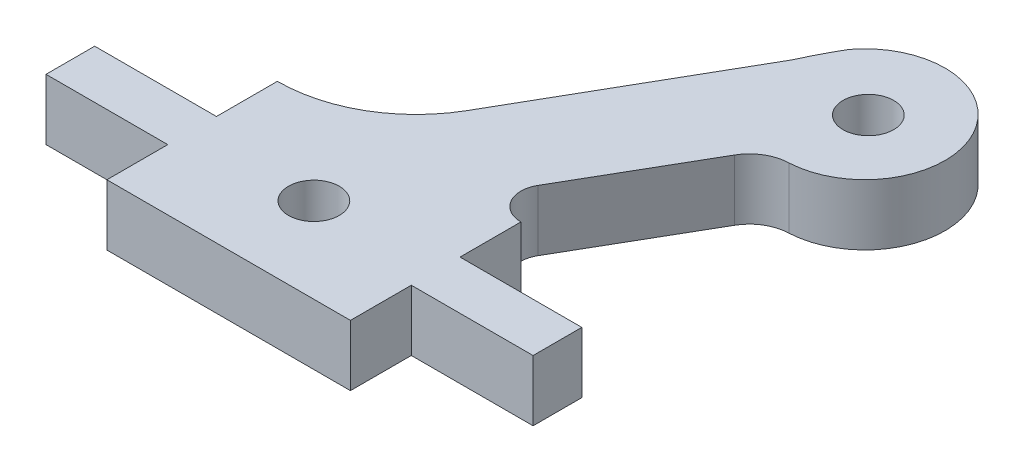
ISO-10303-21;
HEADER;
FILE_DESCRIPTION(('STEP AP214'),'2;1');
FILE_NAME('part.step','',(''),(''),'','','');
FILE_SCHEMA(('AUTOMOTIVE_DESIGN { 1 0 10303 214 1 1 1 1 }'));
ENDSEC;
DATA;
#1=APPLICATION_CONTEXT('core data for automotive mechanical design processes');
#2=APPLICATION_PROTOCOL_DEFINITION('international standard','automotive_design',2000,#1);
#3=PRODUCT_CONTEXT('',#1,'mechanical');
#4=PRODUCT('Part','Part','',(#3));
#5=PRODUCT_RELATED_PRODUCT_CATEGORY('part','',(#4));
#6=PRODUCT_DEFINITION_FORMATION('','',#4);
#7=PRODUCT_DEFINITION_CONTEXT('part definition',#1,'design');
#8=PRODUCT_DEFINITION('design','',#6,#7);
#9=PRODUCT_DEFINITION_SHAPE('','',#8);
#10=(LENGTH_UNIT() NAMED_UNIT(*) SI_UNIT(.MILLI.,.METRE.));
#11=(NAMED_UNIT(*) PLANE_ANGLE_UNIT() SI_UNIT($,.RADIAN.));
#12=(NAMED_UNIT(*) SI_UNIT($,.STERADIAN.) SOLID_ANGLE_UNIT());
#13=UNCERTAINTY_MEASURE_WITH_UNIT(LENGTH_MEASURE(1.E-05),#10,'distance_accuracy_value','');
#14=(GEOMETRIC_REPRESENTATION_CONTEXT(3) GLOBAL_UNCERTAINTY_ASSIGNED_CONTEXT((#13)) GLOBAL_UNIT_ASSIGNED_CONTEXT((#10,
#11,#12)) REPRESENTATION_CONTEXT('',''));
#15=CARTESIAN_POINT('',(0.,0.,0.));
#16=DIRECTION('',(0.,0.,1.));
#17=DIRECTION('',(1.,0.,0.));
#18=AXIS2_PLACEMENT_3D('',#15,#16,#17);
#19=CARTESIAN_POINT('',(182.99665481551,3.,-106.325156903223));
#20=DIRECTION('',(0.,-1.,0.));
#21=DIRECTION('',(0.,0.,-1.));
#22=AXIS2_PLACEMENT_3D('',#19,#20,#21);
#23=CYLINDRICAL_SURFACE('',#22,6.83457572202902);
#24=CARTESIAN_POINT('',(182.99665481551,0.,-106.325156903223));
#25=DIRECTION('',(0.,1.,0.));
#26=DIRECTION('',(0.,0.,1.));
#27=AXIS2_PLACEMENT_3D('',#24,#25,#26);
#28=CIRCLE('',#27,6.83457572202902);
#29=CARTESIAN_POINT('',(182.997065782668,0.,-99.4905811935497));
#30=VERTEX_POINT('',#29);
#31=CARTESIAN_POINT('',(188.915903996961,0.,-102.908445849002));
#32=VERTEX_POINT('',#31);
#33=EDGE_CURVE('E193',#30,#32,#28,.T.);
#34=ORIENTED_EDGE('',*,*,#33,.F.);
#35=DIRECTION('',(0.,-1.,0.));
#36=VECTOR('',#35,1.);
#37=CARTESIAN_POINT('',(182.997065782668,3.,-99.4905811935497));
#38=LINE('',#37,#36);
#39=CARTESIAN_POINT('',(182.997065782668,3.,-99.4905811935497));
#40=VERTEX_POINT('',#39);
#41=EDGE_CURVE('E11',#40,#30,#38,.T.);
#42=ORIENTED_EDGE('',*,*,#41,.F.);
#43=CARTESIAN_POINT('',(182.99665481551,3.,-106.325156903223));
#44=DIRECTION('',(0.,1.,0.));
#45=DIRECTION('',(0.,0.,1.));
#46=AXIS2_PLACEMENT_3D('',#43,#44,#45);
#47=CIRCLE('',#46,6.83457572202902);
#48=CARTESIAN_POINT('',(188.915903996961,3.,-102.908445849002));
#49=VERTEX_POINT('',#48);
#50=EDGE_CURVE('E240',#40,#49,#47,.T.);
#51=ORIENTED_EDGE('',*,*,#50,.T.);
#52=DIRECTION('',(0.,-1.,0.));
#53=VECTOR('',#52,1.);
#54=CARTESIAN_POINT('',(188.915903996961,3.,-102.908445849002));
#55=LINE('',#54,#53);
#56=EDGE_CURVE('E115',#49,#32,#55,.T.);
#57=ORIENTED_EDGE('',*,*,#56,.T.);
#58=EDGE_LOOP('',(#34,#42,#51,#57));
#59=FACE_BOUND('',#58,.T.);
#60=ADVANCED_FACE('F34',(#59),#23,.F.);
#61=CARTESIAN_POINT('',(183.007616290679,3.,-0.0194108837344131));
#62=DIRECTION('',(0.999999994375003,0.,-0.000106065987955363));
#63=DIRECTION('',(-0.000106065987955363,0.,-0.999999994375003));
#64=AXIS2_PLACEMENT_3D('',#61,#62,#63);
#65=PLANE('',#64);
#66=DIRECTION('',(0.000106065987955363,0.,0.999999994375003));
#67=VECTOR('',#66,1.);
#68=CARTESIAN_POINT('',(183.007616290679,0.,-0.0194108837344131));
#69=LINE('',#68,#67);
#70=CARTESIAN_POINT('',(182.99738398508,0.,-96.4905392690514));
#71=VERTEX_POINT('',#70);
#72=EDGE_CURVE('E196',#30,#71,#69,.T.);
#73=ORIENTED_EDGE('',*,*,#72,.T.);
#74=DIRECTION('',(0.,-1.,0.));
#75=VECTOR('',#74,1.);
#76=CARTESIAN_POINT('',(182.99738398508,3.,-96.4905392690514));
#77=LINE('',#76,#75);
#78=CARTESIAN_POINT('',(182.99738398508,3.,-96.4905392690514));
#79=VERTEX_POINT('',#78);
#80=EDGE_CURVE('E42',#79,#71,#77,.T.);
#81=ORIENTED_EDGE('',*,*,#80,.F.);
#82=DIRECTION('',(0.000106065987955363,0.,0.999999994375003));
#83=VECTOR('',#82,1.);
#84=CARTESIAN_POINT('',(183.007616290679,3.,-0.0194108837344131));
#85=LINE('',#84,#83);
#86=EDGE_CURVE('E332',#40,#79,#85,.T.);
#87=ORIENTED_EDGE('',*,*,#86,.F.);
#88=ORIENTED_EDGE('',*,*,#41,.T.);
#89=EDGE_LOOP('',(#73,#81,#87,#88));
#90=FACE_BOUND('',#89,.T.);
#91=ADVANCED_FACE('F335',(#90),#65,.F.);
#92=CARTESIAN_POINT('',(-0.00795884701830244,3.,-96.4754420433089));
#93=DIRECTION('',(8.24960925045281E-05,0.,0.999999996597197));
#94=DIRECTION('',(0.999999996597197,0.,-8.24960925045282E-05));
#95=AXIS2_PLACEMENT_3D('',#92,#93,#94);
#96=PLANE('',#95);
#97=DIRECTION('',(-0.999999996597197,0.,8.24960925045282E-05));
#98=VECTOR('',#97,1.);
#99=CARTESIAN_POINT('',(-0.00795884701830244,0.,-96.4754420433089));
#100=LINE('',#99,#98);
#101=CARTESIAN_POINT('',(176.997300124417,0.,-96.4900442855765));
#102=VERTEX_POINT('',#101);
#103=EDGE_CURVE('E198',#71,#102,#100,.T.);
#104=ORIENTED_EDGE('',*,*,#103,.T.);
#105=DIRECTION('',(0.,-1.,0.));
#106=VECTOR('',#105,1.);
#107=CARTESIAN_POINT('',(176.997300124417,3.,-96.4900442855765));
#108=LINE('',#107,#106);
#109=CARTESIAN_POINT('',(176.997300124417,3.,-96.4900442855765));
#110=VERTEX_POINT('',#109);
#111=EDGE_CURVE('E272',#110,#102,#108,.T.);
#112=ORIENTED_EDGE('',*,*,#111,.F.);
#113=DIRECTION('',(-0.999999996597197,0.,8.24960925045282E-05));
#114=VECTOR('',#113,1.);
#115=CARTESIAN_POINT('',(-0.00795884701830244,3.,-96.4754420433089));
#116=LINE('',#115,#114);
#117=EDGE_CURVE('E281',#79,#110,#116,.T.);
#118=ORIENTED_EDGE('',*,*,#117,.F.);
#119=ORIENTED_EDGE('',*,*,#80,.T.);
#120=EDGE_LOOP('',(#104,#112,#118,#119));
#121=FACE_BOUND('',#120,.T.);
#122=ADVANCED_FACE('F279',(#121),#96,.F.);
#123=CARTESIAN_POINT('',(177.018578166981,3.,-0.0390520486466065));
#124=DIRECTION('',(0.99999997566564,0.,-0.000220609882311122));
#125=DIRECTION('',(-0.000220609882311122,0.,-0.99999997566564));
#126=AXIS2_PLACEMENT_3D('',#123,#124,#125);
#127=PLANE('',#126);
#128=DIRECTION('',(0.000220609882311122,0.,0.99999997566564));
#129=VECTOR('',#128,1.);
#130=CARTESIAN_POINT('',(177.018578166981,0.,-0.0390520486466065));
#131=LINE('',#130,#129);
#132=CARTESIAN_POINT('',(176.997829455041,0.,-94.0906476421746));
#133=VERTEX_POINT('',#132);
#134=EDGE_CURVE('E200',#102,#133,#131,.T.);
#135=ORIENTED_EDGE('',*,*,#134,.T.);
#136=DIRECTION('',(0.,-1.,0.));
#137=VECTOR('',#136,1.);
#138=CARTESIAN_POINT('',(176.997829455041,3.,-94.0906476421746));
#139=LINE('',#138,#137);
#140=CARTESIAN_POINT('',(176.997829455041,3.,-94.0906476421746));
#141=VERTEX_POINT('',#140);
#142=EDGE_CURVE('E269',#141,#133,#139,.T.);
#143=ORIENTED_EDGE('',*,*,#142,.F.);
#144=DIRECTION('',(0.000220609882311122,0.,0.99999997566564));
#145=VECTOR('',#144,1.);
#146=CARTESIAN_POINT('',(177.018578166981,3.,-0.0390520486466065));
#147=LINE('',#146,#145);
#148=EDGE_CURVE('E301',#110,#141,#147,.T.);
#149=ORIENTED_EDGE('',*,*,#148,.F.);
#150=ORIENTED_EDGE('',*,*,#111,.T.);
#151=EDGE_LOOP('',(#135,#143,#149,#150));
#152=FACE_BOUND('',#151,.T.);
#153=ADVANCED_FACE('F292',(#152),#127,.F.);
#154=CARTESIAN_POINT('',(0.,3.,-94.0906476421746));
#155=DIRECTION('',(0.,0.,-1.));
#156=DIRECTION('',(-1.,0.,0.));
#157=AXIS2_PLACEMENT_3D('',#154,#155,#156);
#158=PLANE('',#157);
#159=DIRECTION('',(1.,0.,0.));
#160=VECTOR('',#159,1.);
#161=CARTESIAN_POINT('',(0.,0.,-94.0906476421746));
#162=LINE('',#161,#160);
#163=CARTESIAN_POINT('',(182.997829455041,0.,-94.0906476421746));
#164=VERTEX_POINT('',#163);
#165=EDGE_CURVE('E202',#133,#164,#162,.T.);
#166=ORIENTED_EDGE('',*,*,#165,.T.);
#167=DIRECTION('',(0.,-1.,0.));
#168=VECTOR('',#167,1.);
#169=CARTESIAN_POINT('',(182.997829455041,3.,-94.0906476421746));
#170=LINE('',#169,#168);
#171=CARTESIAN_POINT('',(182.997829455041,3.,-94.0906476421746));
#172=VERTEX_POINT('',#171);
#173=EDGE_CURVE('E266',#172,#164,#170,.T.);
#174=ORIENTED_EDGE('',*,*,#173,.F.);
#175=DIRECTION('',(1.,0.,0.));
#176=VECTOR('',#175,1.);
#177=CARTESIAN_POINT('',(0.,3.,-94.0906476421746));
#178=LINE('',#177,#176);
#179=EDGE_CURVE('E298',#141,#172,#178,.T.);
#180=ORIENTED_EDGE('',*,*,#179,.F.);
#181=ORIENTED_EDGE('',*,*,#142,.T.);
#182=EDGE_LOOP('',(#166,#174,#180,#181));
#183=FACE_BOUND('',#182,.T.);
#184=ADVANCED_FACE('F296',(#183),#158,.F.);
#185=CARTESIAN_POINT('',(182.997829455041,3.,0.));
#186=DIRECTION('',(1.,0.,0.));
#187=DIRECTION('',(0.,0.,-1.));
#188=AXIS2_PLACEMENT_3D('',#185,#186,#187);
#189=PLANE('',#188);
#190=DIRECTION('',(0.,0.,1.));
#191=VECTOR('',#190,1.);
#192=CARTESIAN_POINT('',(182.997829455041,0.,0.));
#193=LINE('',#192,#191);
#194=CARTESIAN_POINT('',(182.997829455041,0.,-91.0906476421746));
#195=VERTEX_POINT('',#194);
#196=EDGE_CURVE('E204',#164,#195,#193,.T.);
#197=ORIENTED_EDGE('',*,*,#196,.T.);
#198=DIRECTION('',(0.,-1.,0.));
#199=VECTOR('',#198,1.);
#200=CARTESIAN_POINT('',(182.997829455041,3.,-91.0906476421746));
#201=LINE('',#200,#199);
#202=CARTESIAN_POINT('',(182.997829455041,3.,-91.0906476421746));
#203=VERTEX_POINT('',#202);
#204=EDGE_CURVE('E263',#203,#195,#201,.T.);
#205=ORIENTED_EDGE('',*,*,#204,.F.);
#206=DIRECTION('',(0.,0.,1.));
#207=VECTOR('',#206,1.);
#208=CARTESIAN_POINT('',(182.997829455041,3.,0.));
#209=LINE('',#208,#207);
#210=EDGE_CURVE('E300',#172,#203,#209,.T.);
#211=ORIENTED_EDGE('',*,*,#210,.F.);
#212=ORIENTED_EDGE('',*,*,#173,.T.);
#213=EDGE_LOOP('',(#197,#205,#211,#212));
#214=FACE_BOUND('',#213,.T.);
#215=ADVANCED_FACE('F347',(#214),#189,.F.);
#216=CARTESIAN_POINT('',(0.,3.,-91.0906476421746));
#217=DIRECTION('',(0.,0.,-1.));
#218=DIRECTION('',(-1.,0.,0.));
#219=AXIS2_PLACEMENT_3D('',#216,#217,#218);
#220=PLANE('',#219);
#221=DIRECTION('',(1.,0.,0.));
#222=VECTOR('',#221,1.);
#223=CARTESIAN_POINT('',(0.,0.,-91.0906476421746));
#224=LINE('',#223,#222);
#225=CARTESIAN_POINT('',(194.997829455041,0.,-91.0906476421746));
#226=VERTEX_POINT('',#225);
#227=EDGE_CURVE('E206',#195,#226,#224,.T.);
#228=ORIENTED_EDGE('',*,*,#227,.T.);
#229=DIRECTION('',(0.,-1.,0.));
#230=VECTOR('',#229,1.);
#231=CARTESIAN_POINT('',(194.997829455041,3.,-91.0906476421746));
#232=LINE('',#231,#230);
#233=CARTESIAN_POINT('',(194.997829455041,3.,-91.0906476421746));
#234=VERTEX_POINT('',#233);
#235=EDGE_CURVE('E260',#234,#226,#232,.T.);
#236=ORIENTED_EDGE('',*,*,#235,.F.);
#237=DIRECTION('',(1.,0.,0.));
#238=VECTOR('',#237,1.);
#239=CARTESIAN_POINT('',(0.,3.,-91.0906476421746));
#240=LINE('',#239,#238);
#241=EDGE_CURVE('E303',#203,#234,#240,.T.);
#242=ORIENTED_EDGE('',*,*,#241,.F.);
#243=ORIENTED_EDGE('',*,*,#204,.T.);
#244=EDGE_LOOP('',(#228,#236,#242,#243));
#245=FACE_BOUND('',#244,.T.);
#246=ADVANCED_FACE('F350',(#245),#220,.F.);
#247=CARTESIAN_POINT('',(194.997829455041,3.,0.));
#248=DIRECTION('',(-1.,0.,0.));
#249=DIRECTION('',(0.,0.,1.));
#250=AXIS2_PLACEMENT_3D('',#247,#248,#249);
#251=PLANE('',#250);
#252=DIRECTION('',(0.,0.,-1.));
#253=VECTOR('',#252,1.);
#254=CARTESIAN_POINT('',(194.997829455041,0.,0.));
#255=LINE('',#254,#253);
#256=CARTESIAN_POINT('',(194.997829455041,0.,-94.0906476421746));
#257=VERTEX_POINT('',#256);
#258=EDGE_CURVE('E208',#226,#257,#255,.T.);
#259=ORIENTED_EDGE('',*,*,#258,.T.);
#260=DIRECTION('',(0.,-1.,0.));
#261=VECTOR('',#260,1.);
#262=CARTESIAN_POINT('',(194.997829455041,3.,-94.0906476421746));
#263=LINE('',#262,#261);
#264=CARTESIAN_POINT('',(194.997829455041,3.,-94.0906476421746));
#265=VERTEX_POINT('',#264);
#266=EDGE_CURVE('E257',#265,#257,#263,.T.);
#267=ORIENTED_EDGE('',*,*,#266,.F.);
#268=DIRECTION('',(0.,0.,-1.));
#269=VECTOR('',#268,1.);
#270=CARTESIAN_POINT('',(194.997829455041,3.,0.));
#271=LINE('',#270,#269);
#272=EDGE_CURVE('E309',#234,#265,#271,.T.);
#273=ORIENTED_EDGE('',*,*,#272,.F.);
#274=ORIENTED_EDGE('',*,*,#235,.T.);
#275=EDGE_LOOP('',(#259,#267,#273,#274));
#276=FACE_BOUND('',#275,.T.);
#277=ADVANCED_FACE('F354',(#276),#251,.F.);
#278=CARTESIAN_POINT('',(0.,3.,-94.0906476421746));
#279=DIRECTION('',(0.,0.,-1.));
#280=DIRECTION('',(-1.,0.,0.));
#281=AXIS2_PLACEMENT_3D('',#278,#279,#280);
#282=PLANE('',#281);
#283=DIRECTION('',(1.,0.,0.));
#284=VECTOR('',#283,1.);
#285=CARTESIAN_POINT('',(0.,0.,-94.0906476421746));
#286=LINE('',#285,#284);
#287=CARTESIAN_POINT('',(200.997480003679,0.,-94.0906476421746));
#288=VERTEX_POINT('',#287);
#289=EDGE_CURVE('E210',#257,#288,#286,.T.);
#290=ORIENTED_EDGE('',*,*,#289,.T.);
#291=DIRECTION('',(0.,-1.,0.));
#292=VECTOR('',#291,1.);
#293=CARTESIAN_POINT('',(200.997480003679,3.,-94.0906476421746));
#294=LINE('',#293,#292);
#295=CARTESIAN_POINT('',(200.997480003679,3.,-94.0906476421746));
#296=VERTEX_POINT('',#295);
#297=EDGE_CURVE('E255',#296,#288,#294,.T.);
#298=ORIENTED_EDGE('',*,*,#297,.F.);
#299=DIRECTION('',(1.,0.,0.));
#300=VECTOR('',#299,1.);
#301=CARTESIAN_POINT('',(0.,3.,-94.0906476421746));
#302=LINE('',#301,#300);
#303=EDGE_CURVE('E311',#265,#296,#302,.T.);
#304=ORIENTED_EDGE('',*,*,#303,.F.);
#305=ORIENTED_EDGE('',*,*,#266,.T.);
#306=EDGE_LOOP('',(#290,#298,#304,#305));
#307=FACE_BOUND('',#306,.T.);
#308=ADVANCED_FACE('F358',(#307),#282,.F.);
#309=CARTESIAN_POINT('',(201.002466492641,3.,-0.0106536633148629));
#310=DIRECTION('',(0.999999998595359,0.,-5.30026495982746E-05));
#311=DIRECTION('',(-5.30026495982746E-05,0.,-0.99999999859536));
#312=AXIS2_PLACEMENT_3D('',#309,#310,#311);
#313=PLANE('',#312);
#314=DIRECTION('',(5.30026495982746E-05,0.,0.99999999859536));
#315=VECTOR('',#314,1.);
#316=CARTESIAN_POINT('',(201.002466492641,0.,-0.0106536633148629));
#317=LINE('',#316,#315);
#318=CARTESIAN_POINT('',(200.997352724359,0.,-96.4920241961429));
#319=VERTEX_POINT('',#318);
#320=EDGE_CURVE('E213',#319,#288,#317,.T.);
#321=ORIENTED_EDGE('',*,*,#320,.F.);
#322=DIRECTION('',(0.,-1.,0.));
#323=VECTOR('',#322,1.);
#324=CARTESIAN_POINT('',(200.997352724359,3.,-96.4920241961429));
#325=LINE('',#324,#323);
#326=CARTESIAN_POINT('',(200.997352724359,3.,-96.4920241961429));
#327=VERTEX_POINT('',#326);
#328=EDGE_CURVE('E253',#327,#319,#325,.T.);
#329=ORIENTED_EDGE('',*,*,#328,.F.);
#330=DIRECTION('',(5.30026495982746E-05,0.,0.99999999859536));
#331=VECTOR('',#330,1.);
#332=CARTESIAN_POINT('',(201.002466492641,3.,-0.0106536633148629));
#333=LINE('',#332,#331);
#334=EDGE_CURVE('E313',#327,#296,#333,.T.);
#335=ORIENTED_EDGE('',*,*,#334,.T.);
#336=ORIENTED_EDGE('',*,*,#297,.T.);
#337=EDGE_LOOP('',(#321,#329,#335,#336));
#338=FACE_BOUND('',#337,.T.);
#339=ADVANCED_FACE('F362',(#338),#313,.T.);
#340=CARTESIAN_POINT('',(-0.00795884701696366,3.,-96.4754420433119));
#341=DIRECTION('',(8.24960924906487E-05,0.,0.999999996597197));
#342=DIRECTION('',(0.999999996597197,0.,-8.24960924906487E-05));
#343=AXIS2_PLACEMENT_3D('',#340,#341,#342);
#344=PLANE('',#343);
#345=DIRECTION('',(-0.999999996597197,0.,8.24960924906487E-05));
#346=VECTOR('',#345,1.);
#347=CARTESIAN_POINT('',(-0.00795884701696366,0.,-96.4754420433119));
#348=LINE('',#347,#346);
#349=CARTESIAN_POINT('',(194.997268863695,0.,-96.4915292126681));
#350=VERTEX_POINT('',#349);
#351=EDGE_CURVE('E216',#319,#350,#348,.T.);
#352=ORIENTED_EDGE('',*,*,#351,.T.);
#353=DIRECTION('',(0.,-1.,0.));
#354=VECTOR('',#353,1.);
#355=CARTESIAN_POINT('',(194.997268863695,3.,-96.4915292126681));
#356=LINE('',#355,#354);
#357=CARTESIAN_POINT('',(194.997268863695,3.,-96.4915292126681));
#358=VERTEX_POINT('',#357);
#359=EDGE_CURVE('E250',#358,#350,#356,.T.);
#360=ORIENTED_EDGE('',*,*,#359,.F.);
#361=DIRECTION('',(-0.999999996597197,0.,8.24960924906487E-05));
#362=VECTOR('',#361,1.);
#363=CARTESIAN_POINT('',(-0.00795884701696366,3.,-96.4754420433119));
#364=LINE('',#363,#362);
#365=EDGE_CURVE('E316',#327,#358,#364,.T.);
#366=ORIENTED_EDGE('',*,*,#365,.F.);
#367=ORIENTED_EDGE('',*,*,#328,.T.);
#368=EDGE_LOOP('',(#352,#360,#366,#367));
#369=FACE_BOUND('',#368,.T.);
#370=ADVANCED_FACE('F366',(#369),#344,.F.);
#371=CARTESIAN_POINT('',(195.002954065361,3.,-0.011490782314377));
#372=DIRECTION('',(-0.999999998263852,0.,5.89261960132966E-05));
#373=DIRECTION('',(5.89261960132966E-05,0.,0.999999998263852));
#374=AXIS2_PLACEMENT_3D('',#371,#372,#373);
#375=PLANE('',#374);
#376=DIRECTION('',(-5.89261960132966E-05,0.,-0.999999998263852));
#377=VECTOR('',#376,1.);
#378=CARTESIAN_POINT('',(195.002954065361,0.,-0.011490782314377));
#379=LINE('',#378,#377);
#380=CARTESIAN_POINT('',(194.997092082636,0.,-99.4915711488331));
#381=VERTEX_POINT('',#380);
#382=EDGE_CURVE('E218',#350,#381,#379,.T.);
#383=ORIENTED_EDGE('',*,*,#382,.T.);
#384=DIRECTION('',(0.,-1.,0.));
#385=VECTOR('',#384,1.);
#386=CARTESIAN_POINT('',(194.997092082636,3.,-99.4915711488331));
#387=LINE('',#386,#385);
#388=CARTESIAN_POINT('',(194.997092082636,3.,-99.4915711488331));
#389=VERTEX_POINT('',#388);
#390=EDGE_CURVE('E248',#389,#381,#387,.T.);
#391=ORIENTED_EDGE('',*,*,#390,.F.);
#392=DIRECTION('',(-5.89261960132966E-05,0.,-0.999999998263852));
#393=VECTOR('',#392,1.);
#394=CARTESIAN_POINT('',(195.002954065361,3.,-0.011490782314377));
#395=LINE('',#394,#393);
#396=EDGE_CURVE('E318',#358,#389,#395,.T.);
#397=ORIENTED_EDGE('',*,*,#396,.F.);
#398=ORIENTED_EDGE('',*,*,#359,.T.);
#399=EDGE_LOOP('',(#383,#391,#397,#398));
#400=FACE_BOUND('',#399,.T.);
#401=ADVANCED_FACE('F370',(#400),#375,.F.);
#402=CARTESIAN_POINT('',(194.996929612891,3.,-100.808133255801));
#403=DIRECTION('',(0.,-1.,0.));
#404=DIRECTION('',(0.,0.,-1.));
#405=AXIS2_PLACEMENT_3D('',#402,#403,#404);
#406=CYLINDRICAL_SURFACE('',#405,1.31656211699293);
#407=CARTESIAN_POINT('',(194.996929612891,0.,-100.808133255801));
#408=DIRECTION('',(0.,1.,0.));
#409=DIRECTION('',(0.,0.,1.));
#410=AXIS2_PLACEMENT_3D('',#407,#408,#409);
#411=CIRCLE('',#410,1.31656211699293);
#412=CARTESIAN_POINT('',(193.85671948209,0.,-101.466355608445));
#413=VERTEX_POINT('',#412);
#414=EDGE_CURVE('E221',#413,#381,#411,.T.);
#415=ORIENTED_EDGE('',*,*,#414,.F.);
#416=DIRECTION('',(0.,-1.,0.));
#417=VECTOR('',#416,1.);
#418=CARTESIAN_POINT('',(193.85671948209,3.,-101.466355608445));
#419=LINE('',#418,#417);
#420=CARTESIAN_POINT('',(193.85671948209,3.,-101.466355608445));
#421=VERTEX_POINT('',#420);
#422=EDGE_CURVE('E246',#421,#413,#419,.T.);
#423=ORIENTED_EDGE('',*,*,#422,.F.);
#424=CARTESIAN_POINT('',(194.996929612891,3.,-100.808133255801));
#425=DIRECTION('',(0.,1.,0.));
#426=DIRECTION('',(0.,0.,1.));
#427=AXIS2_PLACEMENT_3D('',#424,#425,#426);
#428=CIRCLE('',#427,1.31656211699293);
#429=EDGE_CURVE('E320',#421,#389,#428,.T.);
#430=ORIENTED_EDGE('',*,*,#429,.T.);
#431=ORIENTED_EDGE('',*,*,#390,.T.);
#432=EDGE_LOOP('',(#415,#423,#430,#431));
#433=FACE_BOUND('',#432,.T.);
#434=ADVANCED_FACE('F374',(#433),#406,.F.);
#435=CARTESIAN_POINT('',(101.47613742915,3.,58.5750102253294));
#436=DIRECTION('',(-0.866070727425119,0.,-0.499921488933338));
#437=DIRECTION('',(-0.499921488933338,0.,0.866070727425119));
#438=AXIS2_PLACEMENT_3D('',#435,#436,#437);
#439=PLANE('',#438);
#440=DIRECTION('',(0.499921488933338,0.,-0.866070727425119));
#441=VECTOR('',#440,1.);
#442=CARTESIAN_POINT('',(101.47613742915,0.,58.5750102253294));
#443=LINE('',#442,#441);
#444=CARTESIAN_POINT('',(197.405251992781,0.,-107.613881171676));
#445=VERTEX_POINT('',#444);
#446=EDGE_CURVE('E224',#413,#445,#443,.T.);
#447=ORIENTED_EDGE('',*,*,#446,.T.);
#448=DIRECTION('',(0.,-1.,0.));
#449=VECTOR('',#448,1.);
#450=CARTESIAN_POINT('',(197.405251992781,3.,-107.613881171676));
#451=LINE('',#450,#449);
#452=CARTESIAN_POINT('',(197.405251992781,3.,-107.613881171676));
#453=VERTEX_POINT('',#452);
#454=EDGE_CURVE('E244',#453,#445,#451,.T.);
#455=ORIENTED_EDGE('',*,*,#454,.F.);
#456=DIRECTION('',(0.499921488933338,0.,-0.866070727425119));
#457=VECTOR('',#456,1.);
#458=CARTESIAN_POINT('',(101.47613742915,3.,58.5750102253294));
#459=LINE('',#458,#457);
#460=EDGE_CURVE('E323',#421,#453,#459,.T.);
#461=ORIENTED_EDGE('',*,*,#460,.F.);
#462=ORIENTED_EDGE('',*,*,#422,.T.);
#463=EDGE_LOOP('',(#447,#455,#461,#462));
#464=FACE_BOUND('',#463,.T.);
#465=ADVANCED_FACE('F378',(#464),#439,.F.);
#466=CARTESIAN_POINT('',(199.137418021574,3.,-106.61391705798));
#467=DIRECTION('',(0.,-1.,0.));
#468=DIRECTION('',(0.,0.,-1.));
#469=AXIS2_PLACEMENT_3D('',#466,#467,#468);
#470=CYLINDRICAL_SURFACE('',#469,2.00008184332102);
#471=CARTESIAN_POINT('',(199.137418021574,0.,-106.61391705798));
#472=DIRECTION('',(0.,1.,0.));
#473=DIRECTION('',(0.,0.,1.));
#474=AXIS2_PLACEMENT_3D('',#471,#472,#473);
#475=CIRCLE('',#474,2.00008184332102);
#476=CARTESIAN_POINT('',(199.090346419336,0.,-108.613444913311));
#477=VERTEX_POINT('',#476);
#478=EDGE_CURVE('E227',#477,#445,#475,.T.);
#479=ORIENTED_EDGE('',*,*,#478,.F.);
#480=DIRECTION('',(0.,-1.,0.));
#481=VECTOR('',#480,1.);
#482=CARTESIAN_POINT('',(199.090346419336,3.,-108.613444913311));
#483=LINE('',#482,#481);
#484=CARTESIAN_POINT('',(199.090346419336,3.,-108.613444913311));
#485=VERTEX_POINT('',#484);
#486=EDGE_CURVE('E179',#485,#477,#483,.T.);
#487=ORIENTED_EDGE('',*,*,#486,.F.);
#488=CARTESIAN_POINT('',(199.137418021574,3.,-106.61391705798));
#489=DIRECTION('',(0.,1.,0.));
#490=DIRECTION('',(0.,0.,1.));
#491=AXIS2_PLACEMENT_3D('',#488,#489,#490);
#492=CIRCLE('',#491,2.00008184332102);
#493=EDGE_CURVE('E172',#485,#453,#492,.T.);
#494=ORIENTED_EDGE('',*,*,#493,.T.);
#495=ORIENTED_EDGE('',*,*,#454,.T.);
#496=EDGE_LOOP('',(#479,#487,#494,#495));
#497=FACE_BOUND('',#496,.T.);
#498=ADVANCED_FACE('F326',(#497),#470,.F.);
#499=CARTESIAN_POINT('',(198.874886601451,3.,-112.558461432084));
#500=DIRECTION('',(0.,-1.,0.));
#501=DIRECTION('',(0.,0.,-1.));
#502=AXIS2_PLACEMENT_3D('',#499,#500,#501);
#503=CYLINDRICAL_SURFACE('',#502,3.95089588150781);
#504=CARTESIAN_POINT('',(198.874886601451,0.,-112.558461432084));
#505=DIRECTION('',(0.,1.,0.));
#506=DIRECTION('',(0.,0.,1.));
#507=AXIS2_PLACEMENT_3D('',#504,#505,#506);
#508=CIRCLE('',#507,3.95089588150781);
#509=CARTESIAN_POINT('',(195.715093083924,0.,-114.930229378809));
#510=VERTEX_POINT('',#509);
#511=EDGE_CURVE('E178',#477,#510,#508,.T.);
#512=ORIENTED_EDGE('',*,*,#511,.T.);
#513=DIRECTION('',(0.,-1.,0.));
#514=VECTOR('',#513,1.);
#515=CARTESIAN_POINT('',(195.715093083924,3.,-114.930229378809));
#516=LINE('',#515,#514);
#517=CARTESIAN_POINT('',(195.715093083924,3.,-114.930229378809));
#518=VERTEX_POINT('',#517);
#519=EDGE_CURVE('E175',#518,#510,#516,.T.);
#520=ORIENTED_EDGE('',*,*,#519,.F.);
#521=CARTESIAN_POINT('',(198.874886601451,3.,-112.558461432084));
#522=DIRECTION('',(0.,1.,0.));
#523=DIRECTION('',(0.,0.,1.));
#524=AXIS2_PLACEMENT_3D('',#521,#522,#523);
#525=CIRCLE('',#524,3.95089588150781);
#526=EDGE_CURVE('E165',#485,#518,#525,.T.);
#527=ORIENTED_EDGE('',*,*,#526,.F.);
#528=ORIENTED_EDGE('',*,*,#486,.T.);
#529=EDGE_LOOP('',(#512,#520,#527,#528));
#530=FACE_BOUND('',#529,.T.);
#531=ADVANCED_FACE('F176',(#530),#503,.T.);
#532=CARTESIAN_POINT('',(213.127289572831,3.,-104.765338451437));
#533=DIRECTION('',(0.,-1.,0.));
#534=DIRECTION('',(0.,0.,-1.));
#535=AXIS2_PLACEMENT_3D('',#532,#533,#534);
#536=CYLINDRICAL_SURFACE('',#535,20.1620830802196);
#537=CARTESIAN_POINT('',(213.127289572831,0.,-104.765338451437));
#538=DIRECTION('',(0.,1.,0.));
#539=DIRECTION('',(0.,0.,1.));
#540=AXIS2_PLACEMENT_3D('',#537,#538,#539);
#541=CIRCLE('',#540,20.1620830802196);
#542=CARTESIAN_POINT('',(194.764370404593,0.,-113.090768996126));
#543=VERTEX_POINT('',#542);
#544=EDGE_CURVE('E108',#510,#543,#541,.T.);
#545=ORIENTED_EDGE('',*,*,#544,.T.);
#546=DIRECTION('',(0.,-1.,0.));
#547=VECTOR('',#546,1.);
#548=CARTESIAN_POINT('',(194.764370404593,3.,-113.090768996126));
#549=LINE('',#548,#547);
#550=CARTESIAN_POINT('',(194.764370404593,3.,-113.090768996126));
#551=VERTEX_POINT('',#550);
#552=EDGE_CURVE('E180',#551,#543,#549,.T.);
#553=ORIENTED_EDGE('',*,*,#552,.F.);
#554=CARTESIAN_POINT('',(213.127289572831,3.,-104.765338451437));
#555=DIRECTION('',(0.,1.,0.));
#556=DIRECTION('',(0.,0.,1.));
#557=AXIS2_PLACEMENT_3D('',#554,#555,#556);
#558=CIRCLE('',#557,20.1620830802196);
#559=EDGE_CURVE('E170',#518,#551,#558,.T.);
#560=ORIENTED_EDGE('',*,*,#559,.F.);
#561=ORIENTED_EDGE('',*,*,#519,.T.);
#562=EDGE_LOOP('',(#545,#553,#560,#561));
#563=FACE_BOUND('',#562,.T.);
#564=ADVANCED_FACE('F182',(#563),#536,.T.);
#565=CARTESIAN_POINT('',(188.997425419136,3.,-95.2910740345503));
#566=DIRECTION('',(0.,-1.,0.));
#567=DIRECTION('',(0.,0.,-1.));
#568=AXIS2_PLACEMENT_3D('',#565,#566,#567);
#569=CYLINDRICAL_SURFACE('',#568,1.25000000000001);
#570=CARTESIAN_POINT('',(188.997425419136,3.,-95.2910740345503));
#571=DIRECTION('',(0.,1.,0.));
#572=DIRECTION('',(0.,0.,1.));
#573=AXIS2_PLACEMENT_3D('',#570,#571,#572);
#574=CIRCLE('',#573,1.25000000000001);
#575=CARTESIAN_POINT('',(188.997425419136,3.,-94.0410740345502));
#576=VERTEX_POINT('',#575);
#577=EDGE_CURVE('E184',#576,#576,#574,.T.);
#578=ORIENTED_EDGE('',*,*,#577,.T.);
#579=EDGE_LOOP('',(#578));
#580=FACE_BOUND('',#579,.T.);
#581=CARTESIAN_POINT('',(188.997425419136,0.,-95.2910740345503));
#582=DIRECTION('',(0.,1.,0.));
#583=DIRECTION('',(0.,0.,1.));
#584=AXIS2_PLACEMENT_3D('',#581,#582,#583);
#585=CIRCLE('',#584,1.25000000000001);
#586=CARTESIAN_POINT('',(188.997425419136,0.,-94.0410740345502));
#587=VERTEX_POINT('',#586);
#588=EDGE_CURVE('E234',#587,#587,#585,.T.);
#589=ORIENTED_EDGE('',*,*,#588,.F.);
#590=EDGE_LOOP('',(#589));
#591=FACE_BOUND('',#590,.T.);
#592=ADVANCED_FACE('F389',(#580,#591),#569,.F.);
#593=CARTESIAN_POINT('',(97.6068368578139,3.,56.0628746770164));
#594=DIRECTION('',(0.867140604980018,0.,0.498063420856108));
#595=DIRECTION('',(0.498063420856108,0.,-0.867140604980018));
#596=AXIS2_PLACEMENT_3D('',#593,#594,#595);
#597=PLANE('',#596);
#598=DIRECTION('',(-0.498063420856108,0.,0.867140604980018));
#599=VECTOR('',#598,1.);
#600=CARTESIAN_POINT('',(97.6068368578139,0.,56.0628746770164));
#601=LINE('',#600,#599);
#602=EDGE_CURVE('E232',#543,#32,#601,.T.);
#603=ORIENTED_EDGE('',*,*,#602,.T.);
#604=ORIENTED_EDGE('',*,*,#56,.F.);
#605=DIRECTION('',(-0.498063420856108,0.,0.867140604980018));
#606=VECTOR('',#605,1.);
#607=CARTESIAN_POINT('',(97.6068368578139,3.,56.0628746770164));
#608=LINE('',#607,#606);
#609=EDGE_CURVE('E50',#551,#49,#608,.T.);
#610=ORIENTED_EDGE('',*,*,#609,.F.);
#611=ORIENTED_EDGE('',*,*,#552,.T.);
#612=EDGE_LOOP('',(#603,#604,#610,#611));
#613=FACE_BOUND('',#612,.T.);
#614=ADVANCED_FACE('F331',(#613),#597,.F.);
#615=CARTESIAN_POINT('',(198.996042034731,3.,-112.6123381241));
#616=DIRECTION('',(0.,-1.,0.));
#617=DIRECTION('',(0.,0.,-1.));
#618=AXIS2_PLACEMENT_3D('',#615,#616,#617);
#619=CYLINDRICAL_SURFACE('',#618,1.25000000000001);
#620=CARTESIAN_POINT('',(198.996042034731,3.,-112.6123381241));
#621=DIRECTION('',(0.,1.,0.));
#622=DIRECTION('',(0.,0.,1.));
#623=AXIS2_PLACEMENT_3D('',#620,#621,#622);
#624=CIRCLE('',#623,1.25000000000001);
#625=CARTESIAN_POINT('',(198.996042034731,3.,-111.3623381241));
#626=VERTEX_POINT('',#625);
#627=EDGE_CURVE('E190',#626,#626,#624,.T.);
#628=ORIENTED_EDGE('',*,*,#627,.T.);
#629=EDGE_LOOP('',(#628));
#630=FACE_BOUND('',#629,.T.);
#631=CARTESIAN_POINT('',(198.996042034731,0.,-112.6123381241));
#632=DIRECTION('',(0.,1.,0.));
#633=DIRECTION('',(0.,0.,1.));
#634=AXIS2_PLACEMENT_3D('',#631,#632,#633);
#635=CIRCLE('',#634,1.25000000000001);
#636=CARTESIAN_POINT('',(198.996042034731,0.,-111.3623381241));
#637=VERTEX_POINT('',#636);
#638=EDGE_CURVE('E237',#637,#637,#635,.T.);
#639=ORIENTED_EDGE('',*,*,#638,.F.);
#640=EDGE_LOOP('',(#639));
#641=FACE_BOUND('',#640,.T.);
#642=ADVANCED_FACE('F392',(#630,#641),#619,.F.);
#643=CARTESIAN_POINT('',(0.,3.,0.));
#644=DIRECTION('',(0.,1.,0.));
#645=DIRECTION('',(0.,0.,1.));
#646=AXIS2_PLACEMENT_3D('',#643,#644,#645);
#647=PLANE('',#646);
#648=ORIENTED_EDGE('',*,*,#50,.F.);
#649=ORIENTED_EDGE('',*,*,#86,.T.);
#650=ORIENTED_EDGE('',*,*,#117,.T.);
#651=ORIENTED_EDGE('',*,*,#148,.T.);
#652=ORIENTED_EDGE('',*,*,#179,.T.);
#653=ORIENTED_EDGE('',*,*,#210,.T.);
#654=ORIENTED_EDGE('',*,*,#241,.T.);
#655=ORIENTED_EDGE('',*,*,#272,.T.);
#656=ORIENTED_EDGE('',*,*,#303,.T.);
#657=ORIENTED_EDGE('',*,*,#334,.F.);
#658=ORIENTED_EDGE('',*,*,#365,.T.);
#659=ORIENTED_EDGE('',*,*,#396,.T.);
#660=ORIENTED_EDGE('',*,*,#429,.F.);
#661=ORIENTED_EDGE('',*,*,#460,.T.);
#662=ORIENTED_EDGE('',*,*,#493,.F.);
#663=ORIENTED_EDGE('',*,*,#526,.T.);
#664=ORIENTED_EDGE('',*,*,#559,.T.);
#665=ORIENTED_EDGE('',*,*,#609,.T.);
#666=EDGE_LOOP('',(#648,#649,#650,#651,#652,#653,#654,#655,#656,#657,#658,#659,#660,#661,#662,
#663,#664,#665));
#667=FACE_BOUND('',#666,.T.);
#668=ORIENTED_EDGE('',*,*,#577,.F.);
#669=EDGE_LOOP('',(#668));
#670=FACE_BOUND('',#669,.T.);
#671=ORIENTED_EDGE('',*,*,#627,.F.);
#672=EDGE_LOOP('',(#671));
#673=FACE_BOUND('',#672,.T.);
#674=ADVANCED_FACE('F167',(#667,#670,#673),#647,.T.);
#675=CARTESIAN_POINT('',(0.,0.,0.));
#676=DIRECTION('',(0.,1.,0.));
#677=DIRECTION('',(0.,0.,1.));
#678=AXIS2_PLACEMENT_3D('',#675,#676,#677);
#679=PLANE('',#678);
#680=ORIENTED_EDGE('',*,*,#33,.T.);
#681=ORIENTED_EDGE('',*,*,#602,.F.);
#682=ORIENTED_EDGE('',*,*,#544,.F.);
#683=ORIENTED_EDGE('',*,*,#511,.F.);
#684=ORIENTED_EDGE('',*,*,#478,.T.);
#685=ORIENTED_EDGE('',*,*,#446,.F.);
#686=ORIENTED_EDGE('',*,*,#414,.T.);
#687=ORIENTED_EDGE('',*,*,#382,.F.);
#688=ORIENTED_EDGE('',*,*,#351,.F.);
#689=ORIENTED_EDGE('',*,*,#320,.T.);
#690=ORIENTED_EDGE('',*,*,#289,.F.);
#691=ORIENTED_EDGE('',*,*,#258,.F.);
#692=ORIENTED_EDGE('',*,*,#227,.F.);
#693=ORIENTED_EDGE('',*,*,#196,.F.);
#694=ORIENTED_EDGE('',*,*,#165,.F.);
#695=ORIENTED_EDGE('',*,*,#134,.F.);
#696=ORIENTED_EDGE('',*,*,#103,.F.);
#697=ORIENTED_EDGE('',*,*,#72,.F.);
#698=EDGE_LOOP('',(#680,#681,#682,#683,#684,#685,#686,#687,#688,#689,#690,#691,#692,#693,#694,
#695,#696,#697));
#699=FACE_BOUND('',#698,.T.);
#700=ORIENTED_EDGE('',*,*,#588,.T.);
#701=EDGE_LOOP('',(#700));
#702=FACE_BOUND('',#701,.T.);
#703=ORIENTED_EDGE('',*,*,#638,.T.);
#704=EDGE_LOOP('',(#703));
#705=FACE_BOUND('',#704,.T.);
#706=ADVANCED_FACE('F286',(#699,#702,#705),#679,.F.);
#707=CLOSED_SHELL('',(#60,#91,#122,#153,#184,#215,#246,#277,#308,#339,#370,#401,#434,#465,#498,
#531,#564,#592,#614,#642,#674,#706));
#708=MANIFOLD_SOLID_BREP('B2',#707);
#709=ADVANCED_BREP_SHAPE_REPRESENTATION('',(#18,#708),#14);
#710=SHAPE_DEFINITION_REPRESENTATION(#9,#709);
ENDSEC;
END-ISO-10303-21;
